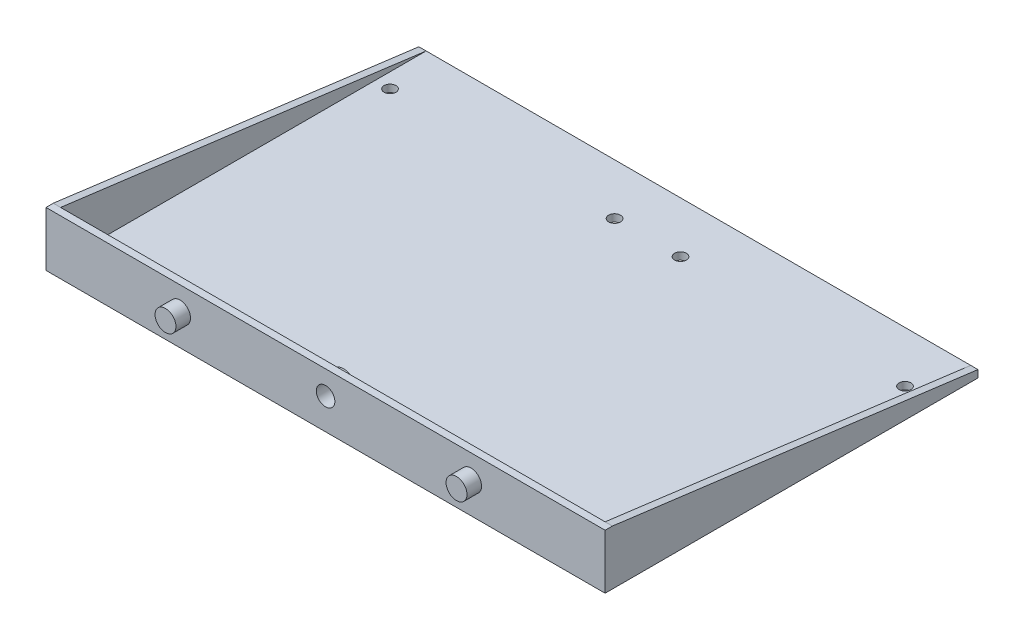
ISO-10303-21;
HEADER;
FILE_DESCRIPTION(('STEP AP214'),'2;1');
FILE_NAME('part.step','',(''),(''),'','','');
FILE_SCHEMA(('AUTOMOTIVE_DESIGN { 1 0 10303 214 1 1 1 1 }'));
ENDSEC;
DATA;
#1=APPLICATION_CONTEXT('core data for automotive mechanical design processes');
#2=APPLICATION_PROTOCOL_DEFINITION('international standard','automotive_design',2000,#1);
#3=PRODUCT_CONTEXT('',#1,'mechanical');
#4=PRODUCT('Part','Part','',(#3));
#5=PRODUCT_RELATED_PRODUCT_CATEGORY('part','',(#4));
#6=PRODUCT_DEFINITION_FORMATION('','',#4);
#7=PRODUCT_DEFINITION_CONTEXT('part definition',#1,'design');
#8=PRODUCT_DEFINITION('design','',#6,#7);
#9=PRODUCT_DEFINITION_SHAPE('','',#8);
#10=(LENGTH_UNIT() NAMED_UNIT(*) SI_UNIT(.MILLI.,.METRE.));
#11=(NAMED_UNIT(*) PLANE_ANGLE_UNIT() SI_UNIT($,.RADIAN.));
#12=(NAMED_UNIT(*) SI_UNIT($,.STERADIAN.) SOLID_ANGLE_UNIT());
#13=UNCERTAINTY_MEASURE_WITH_UNIT(LENGTH_MEASURE(1.E-05),#10,'distance_accuracy_value','');
#14=(GEOMETRIC_REPRESENTATION_CONTEXT(3) GLOBAL_UNCERTAINTY_ASSIGNED_CONTEXT((#13)) GLOBAL_UNIT_ASSIGNED_CONTEXT((#10,
#11,#12)) REPRESENTATION_CONTEXT('',''));
#15=CARTESIAN_POINT('',(0.,0.,0.));
#16=DIRECTION('',(0.,0.,1.));
#17=DIRECTION('',(1.,0.,0.));
#18=AXIS2_PLACEMENT_3D('',#15,#16,#17);
#19=CARTESIAN_POINT('',(0.,14.,0.));
#20=DIRECTION('',(0.,0.,1.));
#21=DIRECTION('',(1.,0.,0.));
#22=AXIS2_PLACEMENT_3D('',#19,#20,#21);
#23=PLANE('',#22);
#24=DIRECTION('',(0.,1.,0.));
#25=VECTOR('',#24,1.);
#26=CARTESIAN_POINT('',(149.7,27.,0.));
#27=LINE('',#26,#25);
#28=CARTESIAN_POINT('',(149.7,14.,0.));
#29=VERTEX_POINT('',#28);
#30=CARTESIAN_POINT('',(149.7,27.,0.));
#31=VERTEX_POINT('',#30);
#32=EDGE_CURVE('E200',#29,#31,#27,.T.);
#33=ORIENTED_EDGE('',*,*,#32,.F.);
#34=DIRECTION('',(1.,0.,0.));
#35=VECTOR('',#34,1.);
#36=CARTESIAN_POINT('',(0.,14.,0.));
#37=LINE('',#36,#35);
#38=CARTESIAN_POINT('',(0.,14.,0.));
#39=VERTEX_POINT('',#38);
#40=EDGE_CURVE('E183',#39,#29,#37,.T.);
#41=ORIENTED_EDGE('',*,*,#40,.F.);
#42=DIRECTION('',(0.,-1.,0.));
#43=VECTOR('',#42,1.);
#44=CARTESIAN_POINT('',(0.,14.,0.));
#45=LINE('',#44,#43);
#46=CARTESIAN_POINT('',(0.,27.,0.));
#47=VERTEX_POINT('',#46);
#48=EDGE_CURVE('E230',#47,#39,#45,.T.);
#49=ORIENTED_EDGE('',*,*,#48,.F.);
#50=DIRECTION('',(1.,0.,0.));
#51=VECTOR('',#50,1.);
#52=CARTESIAN_POINT('',(0.,27.,0.));
#53=LINE('',#52,#51);
#54=EDGE_CURVE('E132',#47,#31,#53,.T.);
#55=ORIENTED_EDGE('',*,*,#54,.T.);
#56=EDGE_LOOP('',(#33,#41,#49,#55));
#57=FACE_BOUND('',#56,.T.);
#58=CARTESIAN_POINT('',(74.85,20.5,0.));
#59=DIRECTION('',(0.,0.,-1.));
#60=DIRECTION('',(1.,0.,0.));
#61=AXIS2_PLACEMENT_3D('',#58,#59,#60);
#62=CIRCLE('',#61,4.00000000000001);
#63=CARTESIAN_POINT('',(78.85,20.5,0.));
#64=VERTEX_POINT('',#63);
#65=EDGE_CURVE('E11',#64,#64,#62,.F.);
#66=ORIENTED_EDGE('',*,*,#65,.T.);
#67=EDGE_LOOP('',(#66));
#68=FACE_BOUND('',#67,.T.);
#69=ADVANCED_FACE('F37',(#57,#68),#23,.F.);
#70=CARTESIAN_POINT('',(0.,12.,-100.5));
#71=DIRECTION('',(0.,0.,-1.));
#72=DIRECTION('',(-1.,0.,0.));
#73=AXIS2_PLACEMENT_3D('',#70,#71,#72);
#74=PLANE('',#73);
#75=DIRECTION('',(1.,0.,0.));
#76=VECTOR('',#75,1.);
#77=CARTESIAN_POINT('',(0.,14.,-100.5));
#78=LINE('',#77,#76);
#79=CARTESIAN_POINT('',(0.,14.,-100.5));
#80=VERTEX_POINT('',#79);
#81=CARTESIAN_POINT('',(149.7,14.,-100.5));
#82=VERTEX_POINT('',#81);
#83=EDGE_CURVE('E179',#80,#82,#78,.T.);
#84=ORIENTED_EDGE('',*,*,#83,.T.);
#85=DIRECTION('',(-1.,0.,0.));
#86=VECTOR('',#85,1.);
#87=CARTESIAN_POINT('',(151.7,14.,-100.5));
#88=LINE('',#87,#86);
#89=CARTESIAN_POINT('',(151.7,14.,-100.5));
#90=VERTEX_POINT('',#89);
#91=EDGE_CURVE('E222',#90,#82,#88,.T.);
#92=ORIENTED_EDGE('',*,*,#91,.F.);
#93=DIRECTION('',(0.,-1.,0.));
#94=VECTOR('',#93,1.);
#95=CARTESIAN_POINT('',(151.7,12.,-100.5));
#96=LINE('',#95,#94);
#97=CARTESIAN_POINT('',(151.7,12.,-100.5));
#98=VERTEX_POINT('',#97);
#99=EDGE_CURVE('E217',#90,#98,#96,.T.);
#100=ORIENTED_EDGE('',*,*,#99,.T.);
#101=DIRECTION('',(1.,0.,0.));
#102=VECTOR('',#101,1.);
#103=CARTESIAN_POINT('',(0.,12.,-100.5));
#104=LINE('',#103,#102);
#105=CARTESIAN_POINT('',(-2.,12.,-100.5));
#106=VERTEX_POINT('',#105);
#107=EDGE_CURVE('E155',#106,#98,#104,.T.);
#108=ORIENTED_EDGE('',*,*,#107,.F.);
#109=DIRECTION('',(0.,1.,0.));
#110=VECTOR('',#109,1.);
#111=CARTESIAN_POINT('',(-2.,14.,-100.5));
#112=LINE('',#111,#110);
#113=CARTESIAN_POINT('',(-2.,14.,-100.5));
#114=VERTEX_POINT('',#113);
#115=EDGE_CURVE('E122',#106,#114,#112,.T.);
#116=ORIENTED_EDGE('',*,*,#115,.T.);
#117=DIRECTION('',(1.,0.,0.));
#118=VECTOR('',#117,1.);
#119=CARTESIAN_POINT('',(-2.,14.,-100.5));
#120=LINE('',#119,#118);
#121=EDGE_CURVE('E233',#114,#80,#120,.T.);
#122=ORIENTED_EDGE('',*,*,#121,.T.);
#123=EDGE_LOOP('',(#84,#92,#100,#108,#116,#122));
#124=FACE_BOUND('',#123,.T.);
#125=ADVANCED_FACE('F261',(#124),#74,.T.);
#126=CARTESIAN_POINT('',(83.92,12.,-9.90000000000002));
#127=DIRECTION('',(0.,1.,0.));
#128=DIRECTION('',(0.,0.,-1.));
#129=AXIS2_PLACEMENT_3D('',#126,#127,#128);
#130=CYLINDRICAL_SURFACE('',#129,1.62499999999999);
#131=CARTESIAN_POINT('',(83.92,12.,-9.90000000000002));
#132=DIRECTION('',(0.,1.,0.));
#133=DIRECTION('',(0.,0.,1.));
#134=AXIS2_PLACEMENT_3D('',#131,#132,#133);
#135=CIRCLE('',#134,1.62499999999999);
#136=CARTESIAN_POINT('',(83.92,12.,-8.27500000000003));
#137=VERTEX_POINT('',#136);
#138=EDGE_CURVE('E163',#137,#137,#135,.T.);
#139=ORIENTED_EDGE('',*,*,#138,.F.);
#140=EDGE_LOOP('',(#139));
#141=FACE_BOUND('',#140,.T.);
#142=CARTESIAN_POINT('',(83.92,14.,-9.90000000000002));
#143=DIRECTION('',(0.,1.,0.));
#144=DIRECTION('',(0.,0.,1.));
#145=AXIS2_PLACEMENT_3D('',#142,#143,#144);
#146=CIRCLE('',#145,1.62499999999999);
#147=CARTESIAN_POINT('',(83.92,14.,-8.27500000000003));
#148=VERTEX_POINT('',#147);
#149=EDGE_CURVE('E194',#148,#148,#146,.T.);
#150=ORIENTED_EDGE('',*,*,#149,.T.);
#151=EDGE_LOOP('',(#150));
#152=FACE_BOUND('',#151,.T.);
#153=ADVANCED_FACE('F266',(#141,#152),#130,.F.);
#154=CARTESIAN_POINT('',(83.92,12.,-86.5));
#155=DIRECTION('',(0.,1.,0.));
#156=DIRECTION('',(0.,0.,-1.));
#157=AXIS2_PLACEMENT_3D('',#154,#155,#156);
#158=CYLINDRICAL_SURFACE('',#157,1.62499999999999);
#159=CARTESIAN_POINT('',(83.92,12.,-86.5));
#160=DIRECTION('',(0.,1.,0.));
#161=DIRECTION('',(0.,0.,1.));
#162=AXIS2_PLACEMENT_3D('',#159,#160,#161);
#163=CIRCLE('',#162,1.62499999999999);
#164=CARTESIAN_POINT('',(83.92,12.,-84.875));
#165=VERTEX_POINT('',#164);
#166=EDGE_CURVE('E160',#165,#165,#163,.T.);
#167=ORIENTED_EDGE('',*,*,#166,.F.);
#168=EDGE_LOOP('',(#167));
#169=FACE_BOUND('',#168,.T.);
#170=CARTESIAN_POINT('',(83.92,14.,-86.5));
#171=DIRECTION('',(0.,1.,0.));
#172=DIRECTION('',(0.,0.,1.));
#173=AXIS2_PLACEMENT_3D('',#170,#171,#172);
#174=CIRCLE('',#173,1.62499999999999);
#175=CARTESIAN_POINT('',(83.92,14.,-84.875));
#176=VERTEX_POINT('',#175);
#177=EDGE_CURVE('E191',#176,#176,#174,.T.);
#178=ORIENTED_EDGE('',*,*,#177,.T.);
#179=EDGE_LOOP('',(#178));
#180=FACE_BOUND('',#179,.T.);
#181=ADVANCED_FACE('F283',(#169,#180),#158,.F.);
#182=CARTESIAN_POINT('',(145.64,12.,-86.5));
#183=DIRECTION('',(0.,1.,0.));
#184=DIRECTION('',(0.,0.,-1.));
#185=AXIS2_PLACEMENT_3D('',#182,#183,#184);
#186=CYLINDRICAL_SURFACE('',#185,1.62499999999998);
#187=CARTESIAN_POINT('',(145.64,12.,-86.5));
#188=DIRECTION('',(0.,1.,0.));
#189=DIRECTION('',(0.,0.,1.));
#190=AXIS2_PLACEMENT_3D('',#187,#188,#189);
#191=CIRCLE('',#190,1.62499999999998);
#192=CARTESIAN_POINT('',(145.64,12.,-84.875));
#193=VERTEX_POINT('',#192);
#194=EDGE_CURVE('E157',#193,#193,#191,.T.);
#195=ORIENTED_EDGE('',*,*,#194,.F.);
#196=EDGE_LOOP('',(#195));
#197=FACE_BOUND('',#196,.T.);
#198=CARTESIAN_POINT('',(145.64,14.,-86.5));
#199=DIRECTION('',(0.,1.,0.));
#200=DIRECTION('',(0.,0.,1.));
#201=AXIS2_PLACEMENT_3D('',#198,#199,#200);
#202=CIRCLE('',#201,1.62499999999998);
#203=CARTESIAN_POINT('',(145.64,14.,-84.875));
#204=VERTEX_POINT('',#203);
#205=EDGE_CURVE('E188',#204,#204,#202,.T.);
#206=ORIENTED_EDGE('',*,*,#205,.T.);
#207=EDGE_LOOP('',(#206));
#208=FACE_BOUND('',#207,.T.);
#209=ADVANCED_FACE('F287',(#197,#208),#186,.F.);
#210=CARTESIAN_POINT('',(4.07,12.,-86.5));
#211=DIRECTION('',(0.,1.,0.));
#212=DIRECTION('',(0.,0.,-1.));
#213=AXIS2_PLACEMENT_3D('',#210,#211,#212);
#214=CYLINDRICAL_SURFACE('',#213,1.625);
#215=CARTESIAN_POINT('',(4.07,12.,-86.5));
#216=DIRECTION('',(0.,1.,0.));
#217=DIRECTION('',(0.,0.,1.));
#218=AXIS2_PLACEMENT_3D('',#215,#216,#217);
#219=CIRCLE('',#218,1.625);
#220=CARTESIAN_POINT('',(4.07,12.,-84.875));
#221=VERTEX_POINT('',#220);
#222=EDGE_CURVE('E152',#221,#221,#219,.T.);
#223=ORIENTED_EDGE('',*,*,#222,.F.);
#224=EDGE_LOOP('',(#223));
#225=FACE_BOUND('',#224,.T.);
#226=CARTESIAN_POINT('',(4.07,14.,-86.5));
#227=DIRECTION('',(0.,1.,0.));
#228=DIRECTION('',(0.,0.,1.));
#229=AXIS2_PLACEMENT_3D('',#226,#227,#228);
#230=CIRCLE('',#229,1.625);
#231=CARTESIAN_POINT('',(4.07,14.,-84.875));
#232=VERTEX_POINT('',#231);
#233=EDGE_CURVE('E176',#232,#232,#230,.T.);
#234=ORIENTED_EDGE('',*,*,#233,.T.);
#235=EDGE_LOOP('',(#234));
#236=FACE_BOUND('',#235,.T.);
#237=ADVANCED_FACE('F290',(#225,#236),#214,.F.);
#238=CARTESIAN_POINT('',(65.79,12.,-86.5));
#239=DIRECTION('',(0.,1.,0.));
#240=DIRECTION('',(0.,0.,-1.));
#241=AXIS2_PLACEMENT_3D('',#238,#239,#240);
#242=CYLINDRICAL_SURFACE('',#241,1.62499999999999);
#243=CARTESIAN_POINT('',(65.79,12.,-86.5));
#244=DIRECTION('',(0.,1.,0.));
#245=DIRECTION('',(0.,0.,1.));
#246=AXIS2_PLACEMENT_3D('',#243,#244,#245);
#247=CIRCLE('',#246,1.62499999999999);
#248=CARTESIAN_POINT('',(65.79,12.,-84.875));
#249=VERTEX_POINT('',#248);
#250=EDGE_CURVE('E149',#249,#249,#247,.T.);
#251=ORIENTED_EDGE('',*,*,#250,.F.);
#252=EDGE_LOOP('',(#251));
#253=FACE_BOUND('',#252,.T.);
#254=CARTESIAN_POINT('',(65.79,14.,-86.5));
#255=DIRECTION('',(0.,1.,0.));
#256=DIRECTION('',(0.,0.,1.));
#257=AXIS2_PLACEMENT_3D('',#254,#255,#256);
#258=CIRCLE('',#257,1.62499999999999);
#259=CARTESIAN_POINT('',(65.79,14.,-84.875));
#260=VERTEX_POINT('',#259);
#261=EDGE_CURVE('E173',#260,#260,#258,.T.);
#262=ORIENTED_EDGE('',*,*,#261,.T.);
#263=EDGE_LOOP('',(#262));
#264=FACE_BOUND('',#263,.T.);
#265=ADVANCED_FACE('F295',(#253,#264),#242,.F.);
#266=CARTESIAN_POINT('',(4.07,12.,-9.90000000000002));
#267=DIRECTION('',(0.,1.,0.));
#268=DIRECTION('',(0.,0.,-1.));
#269=AXIS2_PLACEMENT_3D('',#266,#267,#268);
#270=CYLINDRICAL_SURFACE('',#269,1.625);
#271=CARTESIAN_POINT('',(4.07,12.,-9.90000000000002));
#272=DIRECTION('',(0.,1.,0.));
#273=DIRECTION('',(0.,0.,1.));
#274=AXIS2_PLACEMENT_3D('',#271,#272,#273);
#275=CIRCLE('',#274,1.625);
#276=CARTESIAN_POINT('',(4.07,12.,-8.27500000000002));
#277=VERTEX_POINT('',#276);
#278=EDGE_CURVE('E145',#277,#277,#275,.T.);
#279=ORIENTED_EDGE('',*,*,#278,.F.);
#280=EDGE_LOOP('',(#279));
#281=FACE_BOUND('',#280,.T.);
#282=CARTESIAN_POINT('',(4.07,14.,-9.90000000000002));
#283=DIRECTION('',(0.,1.,0.));
#284=DIRECTION('',(0.,0.,1.));
#285=AXIS2_PLACEMENT_3D('',#282,#283,#284);
#286=CIRCLE('',#285,1.625);
#287=CARTESIAN_POINT('',(4.07,14.,-8.27500000000002));
#288=VERTEX_POINT('',#287);
#289=EDGE_CURVE('E170',#288,#288,#286,.T.);
#290=ORIENTED_EDGE('',*,*,#289,.T.);
#291=EDGE_LOOP('',(#290));
#292=FACE_BOUND('',#291,.T.);
#293=ADVANCED_FACE('F298',(#281,#292),#270,.F.);
#294=CARTESIAN_POINT('',(65.79,12.,-9.90000000000002));
#295=DIRECTION('',(0.,1.,0.));
#296=DIRECTION('',(0.,0.,-1.));
#297=AXIS2_PLACEMENT_3D('',#294,#295,#296);
#298=CYLINDRICAL_SURFACE('',#297,1.625);
#299=CARTESIAN_POINT('',(65.79,12.,-9.90000000000002));
#300=DIRECTION('',(0.,1.,0.));
#301=DIRECTION('',(0.,0.,1.));
#302=AXIS2_PLACEMENT_3D('',#299,#300,#301);
#303=CIRCLE('',#302,1.625);
#304=CARTESIAN_POINT('',(65.79,12.,-8.27500000000002));
#305=VERTEX_POINT('',#304);
#306=EDGE_CURVE('E142',#305,#305,#303,.T.);
#307=ORIENTED_EDGE('',*,*,#306,.F.);
#308=EDGE_LOOP('',(#307));
#309=FACE_BOUND('',#308,.T.);
#310=CARTESIAN_POINT('',(65.79,14.,-9.90000000000002));
#311=DIRECTION('',(0.,1.,0.));
#312=DIRECTION('',(0.,0.,1.));
#313=AXIS2_PLACEMENT_3D('',#310,#311,#312);
#314=CIRCLE('',#313,1.625);
#315=CARTESIAN_POINT('',(65.79,14.,-8.27500000000002));
#316=VERTEX_POINT('',#315);
#317=EDGE_CURVE('E134',#316,#316,#314,.T.);
#318=ORIENTED_EDGE('',*,*,#317,.T.);
#319=EDGE_LOOP('',(#318));
#320=FACE_BOUND('',#319,.T.);
#321=ADVANCED_FACE('F39',(#309,#320),#298,.F.);
#322=CARTESIAN_POINT('',(145.64,12.,-9.90000000000002));
#323=DIRECTION('',(0.,1.,0.));
#324=DIRECTION('',(0.,0.,-1.));
#325=AXIS2_PLACEMENT_3D('',#322,#323,#324);
#326=CYLINDRICAL_SURFACE('',#325,1.625);
#327=CARTESIAN_POINT('',(145.64,12.,-9.90000000000002));
#328=DIRECTION('',(0.,1.,0.));
#329=DIRECTION('',(0.,0.,1.));
#330=AXIS2_PLACEMENT_3D('',#327,#328,#329);
#331=CIRCLE('',#330,1.625);
#332=CARTESIAN_POINT('',(145.64,12.,-8.27500000000002));
#333=VERTEX_POINT('',#332);
#334=EDGE_CURVE('E45',#333,#333,#331,.T.);
#335=ORIENTED_EDGE('',*,*,#334,.F.);
#336=EDGE_LOOP('',(#335));
#337=FACE_BOUND('',#336,.T.);
#338=CARTESIAN_POINT('',(145.64,14.,-9.90000000000002));
#339=DIRECTION('',(0.,1.,0.));
#340=DIRECTION('',(0.,0.,1.));
#341=AXIS2_PLACEMENT_3D('',#338,#339,#340);
#342=CIRCLE('',#341,1.625);
#343=CARTESIAN_POINT('',(145.64,14.,-8.27500000000002));
#344=VERTEX_POINT('',#343);
#345=EDGE_CURVE('E146',#344,#344,#342,.T.);
#346=ORIENTED_EDGE('',*,*,#345,.T.);
#347=EDGE_LOOP('',(#346));
#348=FACE_BOUND('',#347,.T.);
#349=ADVANCED_FACE('F274',(#337,#348),#326,.F.);
#350=CARTESIAN_POINT('',(0.,12.,0.));
#351=DIRECTION('',(0.,-1.,0.));
#352=DIRECTION('',(0.,0.,1.));
#353=AXIS2_PLACEMENT_3D('',#350,#351,#352);
#354=PLANE('',#353);
#355=DIRECTION('',(1.,0.,0.));
#356=VECTOR('',#355,1.);
#357=CARTESIAN_POINT('',(0.,12.,2.));
#358=LINE('',#357,#356);
#359=CARTESIAN_POINT('',(-2.,12.,2.));
#360=VERTEX_POINT('',#359);
#361=CARTESIAN_POINT('',(151.7,12.,2.));
#362=VERTEX_POINT('',#361);
#363=EDGE_CURVE('E109',#360,#362,#358,.T.);
#364=ORIENTED_EDGE('',*,*,#363,.F.);
#365=DIRECTION('',(0.,0.,-1.));
#366=VECTOR('',#365,1.);
#367=CARTESIAN_POINT('',(-2.,12.,0.));
#368=LINE('',#367,#366);
#369=EDGE_CURVE('E119',#360,#106,#368,.T.);
#370=ORIENTED_EDGE('',*,*,#369,.T.);
#371=ORIENTED_EDGE('',*,*,#107,.T.);
#372=DIRECTION('',(0.,0.,1.));
#373=VECTOR('',#372,1.);
#374=CARTESIAN_POINT('',(151.7,12.,0.));
#375=LINE('',#374,#373);
#376=EDGE_CURVE('E131',#98,#362,#375,.T.);
#377=ORIENTED_EDGE('',*,*,#376,.T.);
#378=EDGE_LOOP('',(#364,#370,#371,#377));
#379=FACE_BOUND('',#378,.T.);
#380=ORIENTED_EDGE('',*,*,#306,.T.);
#381=EDGE_LOOP('',(#380));
#382=FACE_BOUND('',#381,.T.);
#383=ORIENTED_EDGE('',*,*,#278,.T.);
#384=EDGE_LOOP('',(#383));
#385=FACE_BOUND('',#384,.T.);
#386=ORIENTED_EDGE('',*,*,#250,.T.);
#387=EDGE_LOOP('',(#386));
#388=FACE_BOUND('',#387,.T.);
#389=ORIENTED_EDGE('',*,*,#222,.T.);
#390=EDGE_LOOP('',(#389));
#391=FACE_BOUND('',#390,.T.);
#392=ORIENTED_EDGE('',*,*,#194,.T.);
#393=EDGE_LOOP('',(#392));
#394=FACE_BOUND('',#393,.T.);
#395=ORIENTED_EDGE('',*,*,#166,.T.);
#396=EDGE_LOOP('',(#395));
#397=FACE_BOUND('',#396,.T.);
#398=ORIENTED_EDGE('',*,*,#138,.T.);
#399=EDGE_LOOP('',(#398));
#400=FACE_BOUND('',#399,.T.);
#401=ORIENTED_EDGE('',*,*,#334,.T.);
#402=EDGE_LOOP('',(#401));
#403=FACE_BOUND('',#402,.T.);
#404=ADVANCED_FACE('F129',(#379,#382,#385,#388,#391,#394,#397,#400,#403),#354,.T.);
#405=CARTESIAN_POINT('',(0.,14.,0.));
#406=DIRECTION('',(0.,-1.,0.));
#407=DIRECTION('',(0.,0.,1.));
#408=AXIS2_PLACEMENT_3D('',#405,#406,#407);
#409=PLANE('',#408);
#410=ORIENTED_EDGE('',*,*,#317,.F.);
#411=EDGE_LOOP('',(#410));
#412=FACE_BOUND('',#411,.T.);
#413=ORIENTED_EDGE('',*,*,#289,.F.);
#414=EDGE_LOOP('',(#413));
#415=FACE_BOUND('',#414,.T.);
#416=ORIENTED_EDGE('',*,*,#261,.F.);
#417=EDGE_LOOP('',(#416));
#418=FACE_BOUND('',#417,.T.);
#419=ORIENTED_EDGE('',*,*,#233,.F.);
#420=EDGE_LOOP('',(#419));
#421=FACE_BOUND('',#420,.T.);
#422=ORIENTED_EDGE('',*,*,#83,.F.);
#423=DIRECTION('',(0.,0.,-1.));
#424=VECTOR('',#423,1.);
#425=CARTESIAN_POINT('',(0.,14.,0.));
#426=LINE('',#425,#424);
#427=EDGE_CURVE('E59',#39,#80,#426,.T.);
#428=ORIENTED_EDGE('',*,*,#427,.F.);
#429=ORIENTED_EDGE('',*,*,#40,.T.);
#430=DIRECTION('',(0.,0.,-1.));
#431=VECTOR('',#430,1.);
#432=CARTESIAN_POINT('',(149.7,14.,0.));
#433=LINE('',#432,#431);
#434=EDGE_CURVE('E185',#29,#82,#433,.T.);
#435=ORIENTED_EDGE('',*,*,#434,.T.);
#436=EDGE_LOOP('',(#422,#428,#429,#435));
#437=FACE_BOUND('',#436,.T.);
#438=ORIENTED_EDGE('',*,*,#205,.F.);
#439=EDGE_LOOP('',(#438));
#440=FACE_BOUND('',#439,.T.);
#441=ORIENTED_EDGE('',*,*,#177,.F.);
#442=EDGE_LOOP('',(#441));
#443=FACE_BOUND('',#442,.T.);
#444=ORIENTED_EDGE('',*,*,#149,.F.);
#445=EDGE_LOOP('',(#444));
#446=FACE_BOUND('',#445,.T.);
#447=ORIENTED_EDGE('',*,*,#345,.F.);
#448=EDGE_LOOP('',(#447));
#449=FACE_BOUND('',#448,.T.);
#450=ADVANCED_FACE('F271',(#412,#415,#418,#421,#437,#440,#443,#446,#449),#409,.F.);
#451=CARTESIAN_POINT('',(0.,27.,2.));
#452=DIRECTION('',(0.,-1.,0.));
#453=DIRECTION('',(0.,0.,1.));
#454=AXIS2_PLACEMENT_3D('',#451,#452,#453);
#455=PLANE('',#454);
#456=DIRECTION('',(-1.,0.,0.));
#457=VECTOR('',#456,1.);
#458=CARTESIAN_POINT('',(151.7,27.,0.));
#459=LINE('',#458,#457);
#460=CARTESIAN_POINT('',(151.7,27.,0.));
#461=VERTEX_POINT('',#460);
#462=EDGE_CURVE('E227',#461,#31,#459,.T.);
#463=ORIENTED_EDGE('',*,*,#462,.T.);
#464=ORIENTED_EDGE('',*,*,#54,.F.);
#465=DIRECTION('',(1.,0.,0.));
#466=VECTOR('',#465,1.);
#467=CARTESIAN_POINT('',(-2.,27.,0.));
#468=LINE('',#467,#466);
#469=CARTESIAN_POINT('',(-2.,27.,0.));
#470=VERTEX_POINT('',#469);
#471=EDGE_CURVE('E137',#470,#47,#468,.T.);
#472=ORIENTED_EDGE('',*,*,#471,.F.);
#473=DIRECTION('',(0.,0.,-1.));
#474=VECTOR('',#473,1.);
#475=CARTESIAN_POINT('',(-2.,27.,2.));
#476=LINE('',#475,#474);
#477=CARTESIAN_POINT('',(-2.,27.,2.));
#478=VERTEX_POINT('',#477);
#479=EDGE_CURVE('E115',#478,#470,#476,.T.);
#480=ORIENTED_EDGE('',*,*,#479,.F.);
#481=DIRECTION('',(1.,0.,0.));
#482=VECTOR('',#481,1.);
#483=CARTESIAN_POINT('',(0.,27.,2.));
#484=LINE('',#483,#482);
#485=CARTESIAN_POINT('',(151.7,27.,2.));
#486=VERTEX_POINT('',#485);
#487=EDGE_CURVE('E111',#478,#486,#484,.T.);
#488=ORIENTED_EDGE('',*,*,#487,.T.);
#489=DIRECTION('',(0.,0.,1.));
#490=VECTOR('',#489,1.);
#491=CARTESIAN_POINT('',(151.7,27.,2.));
#492=LINE('',#491,#490);
#493=EDGE_CURVE('E333',#461,#486,#492,.T.);
#494=ORIENTED_EDGE('',*,*,#493,.F.);
#495=EDGE_LOOP('',(#463,#464,#472,#480,#488,#494));
#496=FACE_BOUND('',#495,.T.);
#497=ADVANCED_FACE('F242',(#496),#455,.F.);
#498=CARTESIAN_POINT('',(0.,14.,2.));
#499=DIRECTION('',(0.,0.,1.));
#500=DIRECTION('',(1.,0.,0.));
#501=AXIS2_PLACEMENT_3D('',#498,#499,#500);
#502=PLANE('',#501);
#503=DIRECTION('',(0.,1.,0.));
#504=VECTOR('',#503,1.);
#505=CARTESIAN_POINT('',(151.7,14.,2.));
#506=LINE('',#505,#504);
#507=EDGE_CURVE('E116',#362,#486,#506,.T.);
#508=ORIENTED_EDGE('',*,*,#507,.T.);
#509=ORIENTED_EDGE('',*,*,#487,.F.);
#510=DIRECTION('',(0.,-1.,0.));
#511=VECTOR('',#510,1.);
#512=CARTESIAN_POINT('',(-2.,14.,2.));
#513=LINE('',#512,#511);
#514=EDGE_CURVE('E104',#478,#360,#513,.T.);
#515=ORIENTED_EDGE('',*,*,#514,.T.);
#516=ORIENTED_EDGE('',*,*,#363,.T.);
#517=EDGE_LOOP('',(#508,#509,#515,#516));
#518=FACE_BOUND('',#517,.T.);
#519=CARTESIAN_POINT('',(34.85,20.5,2.));
#520=DIRECTION('',(0.,0.,-1.));
#521=DIRECTION('',(1.,0.,0.));
#522=AXIS2_PLACEMENT_3D('',#519,#520,#521);
#523=CIRCLE('',#522,2.875);
#524=CARTESIAN_POINT('',(37.725,20.5,2.));
#525=VERTEX_POINT('',#524);
#526=EDGE_CURVE('E339',#525,#525,#523,.T.);
#527=ORIENTED_EDGE('',*,*,#526,.T.);
#528=EDGE_LOOP('',(#527));
#529=FACE_BOUND('',#528,.T.);
#530=CARTESIAN_POINT('',(114.85,20.5,2.));
#531=DIRECTION('',(0.,0.,-1.));
#532=DIRECTION('',(1.,0.,0.));
#533=AXIS2_PLACEMENT_3D('',#530,#531,#532);
#534=CIRCLE('',#533,2.875);
#535=CARTESIAN_POINT('',(117.725,20.5,2.));
#536=VERTEX_POINT('',#535);
#537=EDGE_CURVE('E342',#536,#536,#534,.T.);
#538=ORIENTED_EDGE('',*,*,#537,.T.);
#539=EDGE_LOOP('',(#538));
#540=FACE_BOUND('',#539,.T.);
#541=CARTESIAN_POINT('',(74.85,20.5,2.));
#542=DIRECTION('',(0.,0.,-1.));
#543=DIRECTION('',(1.,0.,0.));
#544=AXIS2_PLACEMENT_3D('',#541,#542,#543);
#545=CIRCLE('',#544,2.54999999999999);
#546=CARTESIAN_POINT('',(77.4,20.5,2.));
#547=VERTEX_POINT('',#546);
#548=EDGE_CURVE('E198',#547,#547,#545,.T.);
#549=ORIENTED_EDGE('',*,*,#548,.T.);
#550=EDGE_LOOP('',(#549));
#551=FACE_BOUND('',#550,.T.);
#552=ADVANCED_FACE('F106',(#518,#529,#540,#551),#502,.T.);
#553=CARTESIAN_POINT('',(0.,14.,0.));
#554=DIRECTION('',(-1.,0.,0.));
#555=DIRECTION('',(0.,0.,1.));
#556=AXIS2_PLACEMENT_3D('',#553,#554,#555);
#557=PLANE('',#556);
#558=DIRECTION('',(0.,0.128284441850094,0.991737415841114));
#559=VECTOR('',#558,1.);
#560=CARTESIAN_POINT('',(0.,26.7860603257297,-1.65391825108942));
#561=LINE('',#560,#559);
#562=EDGE_CURVE('E52',#80,#47,#561,.T.);
#563=ORIENTED_EDGE('',*,*,#562,.T.);
#564=ORIENTED_EDGE('',*,*,#48,.T.);
#565=ORIENTED_EDGE('',*,*,#427,.T.);
#566=EDGE_LOOP('',(#563,#564,#565));
#567=FACE_BOUND('',#566,.T.);
#568=ADVANCED_FACE('F250',(#567),#557,.F.);
#569=CARTESIAN_POINT('',(-2.,26.7860603257297,-1.65391825108942));
#570=DIRECTION('',(0.,-0.991737415841114,0.128284441850094));
#571=DIRECTION('',(0.,0.128284441850094,0.991737415841114));
#572=AXIS2_PLACEMENT_3D('',#569,#570,#571);
#573=PLANE('',#572);
#574=ORIENTED_EDGE('',*,*,#562,.F.);
#575=ORIENTED_EDGE('',*,*,#121,.F.);
#576=DIRECTION('',(0.,0.128284441850094,0.991737415841114));
#577=VECTOR('',#576,1.);
#578=CARTESIAN_POINT('',(-2.,26.7860603257297,-1.65391825108942));
#579=LINE('',#578,#577);
#580=EDGE_CURVE('E126',#114,#470,#579,.T.);
#581=ORIENTED_EDGE('',*,*,#580,.T.);
#582=ORIENTED_EDGE('',*,*,#471,.T.);
#583=EDGE_LOOP('',(#574,#575,#581,#582));
#584=FACE_BOUND('',#583,.T.);
#585=ADVANCED_FACE('F239',(#584),#573,.F.);
#586=CARTESIAN_POINT('',(-2.,14.,0.));
#587=DIRECTION('',(-1.,0.,0.));
#588=DIRECTION('',(0.,0.,1.));
#589=AXIS2_PLACEMENT_3D('',#586,#587,#588);
#590=PLANE('',#589);
#591=ORIENTED_EDGE('',*,*,#580,.F.);
#592=ORIENTED_EDGE('',*,*,#115,.F.);
#593=ORIENTED_EDGE('',*,*,#369,.F.);
#594=ORIENTED_EDGE('',*,*,#514,.F.);
#595=ORIENTED_EDGE('',*,*,#479,.T.);
#596=EDGE_LOOP('',(#591,#592,#593,#594,#595));
#597=FACE_BOUND('',#596,.T.);
#598=ADVANCED_FACE('F120',(#597),#590,.T.);
#599=CARTESIAN_POINT('',(149.7,14.,0.));
#600=DIRECTION('',(1.,0.,0.));
#601=DIRECTION('',(0.,0.,-1.));
#602=AXIS2_PLACEMENT_3D('',#599,#600,#601);
#603=PLANE('',#602);
#604=ORIENTED_EDGE('',*,*,#32,.T.);
#605=DIRECTION('',(0.,-0.128284441850094,-0.991737415841113));
#606=VECTOR('',#605,1.);
#607=CARTESIAN_POINT('',(149.7,14.,-100.5));
#608=LINE('',#607,#606);
#609=EDGE_CURVE('E205',#31,#82,#608,.T.);
#610=ORIENTED_EDGE('',*,*,#609,.T.);
#611=ORIENTED_EDGE('',*,*,#434,.F.);
#612=EDGE_LOOP('',(#604,#610,#611));
#613=FACE_BOUND('',#612,.T.);
#614=ADVANCED_FACE('F376',(#613),#603,.F.);
#615=CARTESIAN_POINT('',(151.7,14.,-100.5));
#616=DIRECTION('',(0.,-0.991737415841114,0.128284441850094));
#617=DIRECTION('',(0.,0.128284441850094,0.991737415841114));
#618=AXIS2_PLACEMENT_3D('',#615,#616,#617);
#619=PLANE('',#618);
#620=ORIENTED_EDGE('',*,*,#609,.F.);
#621=ORIENTED_EDGE('',*,*,#462,.F.);
#622=DIRECTION('',(0.,-0.128284441850094,-0.991737415841113));
#623=VECTOR('',#622,1.);
#624=CARTESIAN_POINT('',(151.7,14.,-100.5));
#625=LINE('',#624,#623);
#626=EDGE_CURVE('E221',#461,#90,#625,.T.);
#627=ORIENTED_EDGE('',*,*,#626,.T.);
#628=ORIENTED_EDGE('',*,*,#91,.T.);
#629=EDGE_LOOP('',(#620,#621,#627,#628));
#630=FACE_BOUND('',#629,.T.);
#631=ADVANCED_FACE('F329',(#630),#619,.F.);
#632=CARTESIAN_POINT('',(151.7,14.,0.));
#633=DIRECTION('',(1.,0.,0.));
#634=DIRECTION('',(0.,0.,-1.));
#635=AXIS2_PLACEMENT_3D('',#632,#633,#634);
#636=PLANE('',#635);
#637=ORIENTED_EDGE('',*,*,#376,.F.);
#638=ORIENTED_EDGE('',*,*,#99,.F.);
#639=ORIENTED_EDGE('',*,*,#626,.F.);
#640=ORIENTED_EDGE('',*,*,#493,.T.);
#641=ORIENTED_EDGE('',*,*,#507,.F.);
#642=EDGE_LOOP('',(#637,#638,#639,#640,#641));
#643=FACE_BOUND('',#642,.T.);
#644=ADVANCED_FACE('F332',(#643),#636,.T.);
#645=CARTESIAN_POINT('',(74.85,20.5,10.));
#646=DIRECTION('',(0.,0.,-1.));
#647=DIRECTION('',(-1.,0.,0.));
#648=AXIS2_PLACEMENT_3D('',#645,#646,#647);
#649=CYLINDRICAL_SURFACE('',#648,2.54999999999999);
#650=ORIENTED_EDGE('',*,*,#548,.F.);
#651=EDGE_LOOP('',(#650));
#652=FACE_BOUND('',#651,.T.);
#653=CARTESIAN_POINT('',(74.85,20.5,-3.));
#654=DIRECTION('',(0.,0.,1.));
#655=DIRECTION('',(-1.,0.,0.));
#656=AXIS2_PLACEMENT_3D('',#653,#654,#655);
#657=CIRCLE('',#656,2.54999999999999);
#658=CARTESIAN_POINT('',(72.3,20.5,-3.));
#659=VERTEX_POINT('',#658);
#660=EDGE_CURVE('E208',#659,#659,#657,.T.);
#661=ORIENTED_EDGE('',*,*,#660,.F.);
#662=EDGE_LOOP('',(#661));
#663=FACE_BOUND('',#662,.T.);
#664=ADVANCED_FACE('F368',(#652,#663),#649,.F.);
#665=CARTESIAN_POINT('',(74.85,20.5,-3.));
#666=DIRECTION('',(0.,0.,-1.));
#667=DIRECTION('',(-1.,0.,0.));
#668=AXIS2_PLACEMENT_3D('',#665,#666,#667);
#669=PLANE('',#668);
#670=CARTESIAN_POINT('',(74.85,20.5,-3.));
#671=DIRECTION('',(0.,0.,1.));
#672=DIRECTION('',(-1.,0.,0.));
#673=AXIS2_PLACEMENT_3D('',#670,#671,#672);
#674=CIRCLE('',#673,4.00000000000001);
#675=CARTESIAN_POINT('',(70.85,20.5,-3.));
#676=VERTEX_POINT('',#675);
#677=EDGE_CURVE('E201',#676,#676,#674,.T.);
#678=ORIENTED_EDGE('',*,*,#677,.F.);
#679=EDGE_LOOP('',(#678));
#680=FACE_BOUND('',#679,.T.);
#681=ORIENTED_EDGE('',*,*,#660,.T.);
#682=EDGE_LOOP('',(#681));
#683=FACE_BOUND('',#682,.T.);
#684=ADVANCED_FACE('F363',(#680,#683),#669,.T.);
#685=CARTESIAN_POINT('',(74.85,20.5,-3.));
#686=DIRECTION('',(0.,0.,1.));
#687=DIRECTION('',(1.,0.,0.));
#688=AXIS2_PLACEMENT_3D('',#685,#686,#687);
#689=CYLINDRICAL_SURFACE('',#688,4.00000000000001);
#690=ORIENTED_EDGE('',*,*,#677,.T.);
#691=EDGE_LOOP('',(#690));
#692=FACE_BOUND('',#691,.T.);
#693=ORIENTED_EDGE('',*,*,#65,.F.);
#694=EDGE_LOOP('',(#693));
#695=FACE_BOUND('',#694,.T.);
#696=ADVANCED_FACE('F353',(#692,#695),#689,.T.);
#697=CARTESIAN_POINT('',(114.85,20.5,6.));
#698=DIRECTION('',(0.,0.,-1.));
#699=DIRECTION('',(-1.,0.,0.));
#700=AXIS2_PLACEMENT_3D('',#697,#698,#699);
#701=CYLINDRICAL_SURFACE('',#700,2.875);
#702=CARTESIAN_POINT('',(114.85,20.5,6.));
#703=DIRECTION('',(0.,0.,-1.));
#704=DIRECTION('',(1.,0.,0.));
#705=AXIS2_PLACEMENT_3D('',#702,#703,#704);
#706=CIRCLE('',#705,2.875);
#707=CARTESIAN_POINT('',(117.725,20.5,6.));
#708=VERTEX_POINT('',#707);
#709=EDGE_CURVE('E213',#708,#708,#706,.T.);
#710=ORIENTED_EDGE('',*,*,#709,.T.);
#711=EDGE_LOOP('',(#710));
#712=FACE_BOUND('',#711,.T.);
#713=ORIENTED_EDGE('',*,*,#537,.F.);
#714=EDGE_LOOP('',(#713));
#715=FACE_BOUND('',#714,.T.);
#716=ADVANCED_FACE('F350',(#712,#715),#701,.T.);
#717=CARTESIAN_POINT('',(0.,14.,6.));
#718=DIRECTION('',(0.,0.,1.));
#719=DIRECTION('',(1.,0.,0.));
#720=AXIS2_PLACEMENT_3D('',#717,#718,#719);
#721=PLANE('',#720);
#722=ORIENTED_EDGE('',*,*,#709,.F.);
#723=EDGE_LOOP('',(#722));
#724=FACE_BOUND('',#723,.T.);
#725=ADVANCED_FACE('F352',(#724),#721,.T.);
#726=CARTESIAN_POINT('',(34.85,20.5,6.));
#727=DIRECTION('',(0.,0.,-1.));
#728=DIRECTION('',(-1.,0.,0.));
#729=AXIS2_PLACEMENT_3D('',#726,#727,#728);
#730=CYLINDRICAL_SURFACE('',#729,2.875);
#731=CARTESIAN_POINT('',(34.85,20.5,6.));
#732=DIRECTION('',(0.,0.,-1.));
#733=DIRECTION('',(1.,0.,0.));
#734=AXIS2_PLACEMENT_3D('',#731,#732,#733);
#735=CIRCLE('',#734,2.875);
#736=CARTESIAN_POINT('',(37.725,20.5,6.));
#737=VERTEX_POINT('',#736);
#738=EDGE_CURVE('E337',#737,#737,#735,.T.);
#739=ORIENTED_EDGE('',*,*,#738,.T.);
#740=EDGE_LOOP('',(#739));
#741=FACE_BOUND('',#740,.T.);
#742=ORIENTED_EDGE('',*,*,#526,.F.);
#743=EDGE_LOOP('',(#742));
#744=FACE_BOUND('',#743,.T.);
#745=ADVANCED_FACE('F360',(#741,#744),#730,.T.);
#746=CARTESIAN_POINT('',(34.85,20.5,6.));
#747=DIRECTION('',(0.,0.,1.));
#748=DIRECTION('',(1.,0.,0.));
#749=AXIS2_PLACEMENT_3D('',#746,#747,#748);
#750=PLANE('',#749);
#751=ORIENTED_EDGE('',*,*,#738,.F.);
#752=EDGE_LOOP('',(#751));
#753=FACE_BOUND('',#752,.T.);
#754=ADVANCED_FACE('F429',(#753),#750,.T.);
#755=CLOSED_SHELL('',(#69,#125,#153,#181,#209,#237,#265,#293,#321,#349,#404,#450,#497,#552,#568,
#585,#598,#614,#631,#644,#664,#684,#696,#716,#725,#745,#754));
#756=MANIFOLD_SOLID_BREP('B2',#755);
#757=ADVANCED_BREP_SHAPE_REPRESENTATION('',(#18,#756),#14);
#758=SHAPE_DEFINITION_REPRESENTATION(#9,#757);
ENDSEC;
END-ISO-10303-21;
